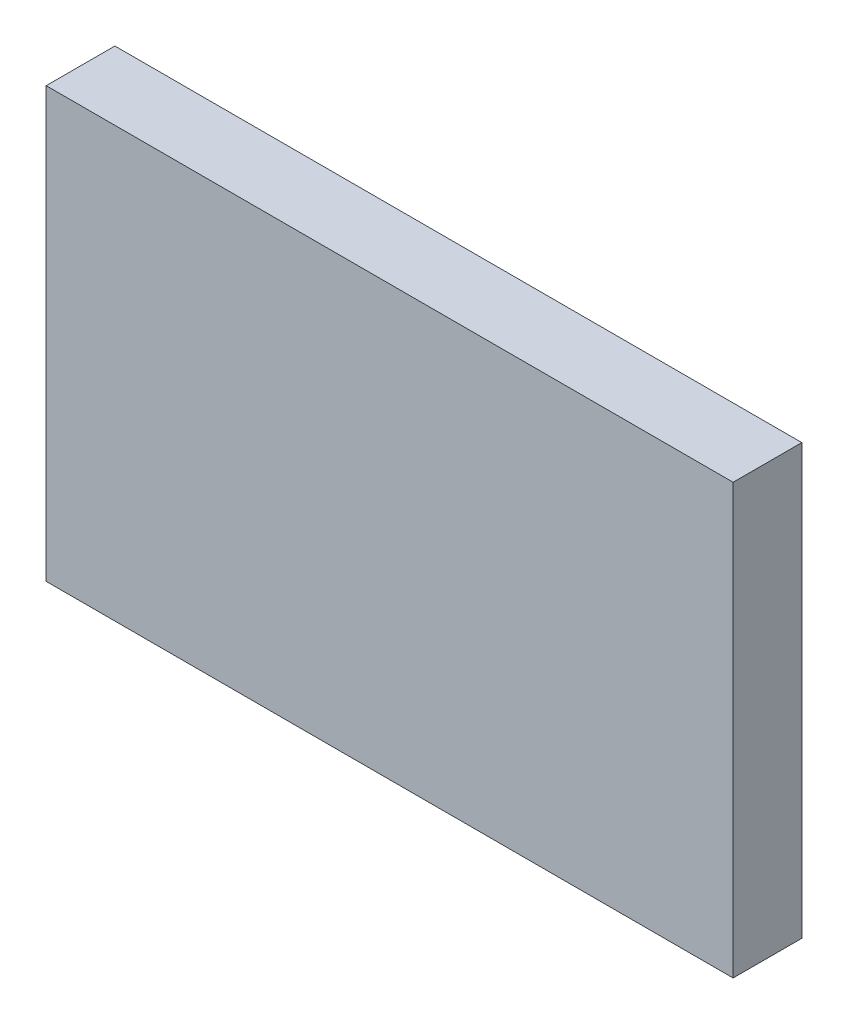
ISO-10303-21;
HEADER;
FILE_DESCRIPTION(('STEP AP214'),'2;1');
FILE_NAME('part.step','',(''),(''),'','','');
FILE_SCHEMA(('AUTOMOTIVE_DESIGN { 1 0 10303 214 1 1 1 1 }'));
ENDSEC;
DATA;
#1=APPLICATION_CONTEXT('core data for automotive mechanical design processes');
#2=APPLICATION_PROTOCOL_DEFINITION('international standard','automotive_design',2000,#1);
#3=PRODUCT_CONTEXT('',#1,'mechanical');
#4=PRODUCT('Part','Part','',(#3));
#5=PRODUCT_RELATED_PRODUCT_CATEGORY('part','',(#4));
#6=PRODUCT_DEFINITION_FORMATION('','',#4);
#7=PRODUCT_DEFINITION_CONTEXT('part definition',#1,'design');
#8=PRODUCT_DEFINITION('design','',#6,#7);
#9=PRODUCT_DEFINITION_SHAPE('','',#8);
#10=(LENGTH_UNIT() NAMED_UNIT(*) SI_UNIT(.MILLI.,.METRE.));
#11=(NAMED_UNIT(*) PLANE_ANGLE_UNIT() SI_UNIT($,.RADIAN.));
#12=(NAMED_UNIT(*) SI_UNIT($,.STERADIAN.) SOLID_ANGLE_UNIT());
#13=UNCERTAINTY_MEASURE_WITH_UNIT(LENGTH_MEASURE(1.E-05),#10,'distance_accuracy_value','');
#14=(GEOMETRIC_REPRESENTATION_CONTEXT(3) GLOBAL_UNCERTAINTY_ASSIGNED_CONTEXT((#13)) GLOBAL_UNIT_ASSIGNED_CONTEXT((#10,
#11,#12)) REPRESENTATION_CONTEXT('',''));
#15=CARTESIAN_POINT('',(0.,0.,0.));
#16=DIRECTION('',(0.,0.,1.));
#17=DIRECTION('',(1.,0.,0.));
#18=AXIS2_PLACEMENT_3D('',#15,#16,#17);
#19=CARTESIAN_POINT('',(1.00000054,-0.62500002,0.1999996));
#20=DIRECTION('',(0.,0.,1.));
#21=DIRECTION('',(1.,0.,0.));
#22=AXIS2_PLACEMENT_3D('',#19,#20,#21);
#23=PLANE('',#22);
#24=DIRECTION('',(0.,1.,0.));
#25=VECTOR('',#24,1.);
#26=CARTESIAN_POINT('',(-1.00000054,-0.62500002,0.1999996));
#27=LINE('',#26,#25);
#28=CARTESIAN_POINT('',(-1.00000054,-0.62500002,0.1999996));
#29=VERTEX_POINT('',#28);
#30=CARTESIAN_POINT('',(-1.00000054,0.62500002,0.1999996));
#31=VERTEX_POINT('',#30);
#32=EDGE_CURVE('E53',#29,#31,#27,.T.);
#33=ORIENTED_EDGE('',*,*,#32,.F.);
#34=DIRECTION('',(1.,0.,0.));
#35=VECTOR('',#34,1.);
#36=CARTESIAN_POINT('',(1.00000054,-0.62500002,0.1999996));
#37=LINE('',#36,#35);
#38=CARTESIAN_POINT('',(1.00000054,-0.62500002,0.1999996));
#39=VERTEX_POINT('',#38);
#40=EDGE_CURVE('E68',#39,#29,#37,.F.);
#41=ORIENTED_EDGE('',*,*,#40,.F.);
#42=DIRECTION('',(0.,1.,0.));
#43=VECTOR('',#42,1.);
#44=CARTESIAN_POINT('',(1.00000054,0.62500002,0.1999996));
#45=LINE('',#44,#43);
#46=CARTESIAN_POINT('',(1.00000054,0.62500002,0.1999996));
#47=VERTEX_POINT('',#46);
#48=EDGE_CURVE('E20',#47,#39,#45,.F.);
#49=ORIENTED_EDGE('',*,*,#48,.F.);
#50=DIRECTION('',(1.,0.,0.));
#51=VECTOR('',#50,1.);
#52=CARTESIAN_POINT('',(-1.00000054,0.62500002,0.1999996));
#53=LINE('',#52,#51);
#54=EDGE_CURVE('E58',#31,#47,#53,.T.);
#55=ORIENTED_EDGE('',*,*,#54,.F.);
#56=EDGE_LOOP('',(#33,#41,#49,#55));
#57=FACE_BOUND('',#56,.T.);
#58=ADVANCED_FACE('F17',(#57),#23,.T.);
#59=CARTESIAN_POINT('',(1.00000054,0.62500002,0.));
#60=DIRECTION('',(1.,0.,0.));
#61=DIRECTION('',(0.,0.,-1.));
#62=AXIS2_PLACEMENT_3D('',#59,#60,#61);
#63=PLANE('',#62);
#64=DIRECTION('',(0.,0.,-1.));
#65=VECTOR('',#64,1.);
#66=CARTESIAN_POINT('',(1.00000054,-0.62500002,0.));
#67=LINE('',#66,#65);
#68=CARTESIAN_POINT('',(1.00000054,-0.62500002,0.));
#69=VERTEX_POINT('',#68);
#70=EDGE_CURVE('E79',#69,#39,#67,.F.);
#71=ORIENTED_EDGE('',*,*,#70,.F.);
#72=DIRECTION('',(0.,1.,0.));
#73=VECTOR('',#72,1.);
#74=CARTESIAN_POINT('',(1.00000054,-0.62500002,0.));
#75=LINE('',#74,#73);
#76=CARTESIAN_POINT('',(1.00000054,0.62500002,0.));
#77=VERTEX_POINT('',#76);
#78=EDGE_CURVE('E74',#69,#77,#75,.T.);
#79=ORIENTED_EDGE('',*,*,#78,.T.);
#80=DIRECTION('',(0.,0.,1.));
#81=VECTOR('',#80,1.);
#82=CARTESIAN_POINT('',(1.00000054,0.62500002,0.));
#83=LINE('',#82,#81);
#84=EDGE_CURVE('E63',#47,#77,#83,.F.);
#85=ORIENTED_EDGE('',*,*,#84,.F.);
#86=ORIENTED_EDGE('',*,*,#48,.T.);
#87=EDGE_LOOP('',(#71,#79,#85,#86));
#88=FACE_BOUND('',#87,.T.);
#89=ADVANCED_FACE('F73',(#88),#63,.T.);
#90=CARTESIAN_POINT('',(-1.00000054,0.62500002,0.));
#91=DIRECTION('',(0.,1.,0.));
#92=DIRECTION('',(0.,0.,1.));
#93=AXIS2_PLACEMENT_3D('',#90,#91,#92);
#94=PLANE('',#93);
#95=ORIENTED_EDGE('',*,*,#84,.T.);
#96=DIRECTION('',(1.,0.,0.));
#97=VECTOR('',#96,1.);
#98=CARTESIAN_POINT('',(1.00000054,0.62500002,0.));
#99=LINE('',#98,#97);
#100=CARTESIAN_POINT('',(-1.00000054,0.62500002,0.));
#101=VERTEX_POINT('',#100);
#102=EDGE_CURVE('E84',#77,#101,#99,.F.);
#103=ORIENTED_EDGE('',*,*,#102,.T.);
#104=DIRECTION('',(0.,0.,1.));
#105=VECTOR('',#104,1.);
#106=CARTESIAN_POINT('',(-1.00000054,0.62500002,0.));
#107=LINE('',#106,#105);
#108=EDGE_CURVE('E65',#31,#101,#107,.F.);
#109=ORIENTED_EDGE('',*,*,#108,.F.);
#110=ORIENTED_EDGE('',*,*,#54,.T.);
#111=EDGE_LOOP('',(#95,#103,#109,#110));
#112=FACE_BOUND('',#111,.T.);
#113=ADVANCED_FACE('F60',(#112),#94,.T.);
#114=CARTESIAN_POINT('',(-1.00000054,-0.62500002,0.));
#115=DIRECTION('',(-1.,0.,0.));
#116=DIRECTION('',(0.,0.,1.));
#117=AXIS2_PLACEMENT_3D('',#114,#115,#116);
#118=PLANE('',#117);
#119=ORIENTED_EDGE('',*,*,#108,.T.);
#120=DIRECTION('',(0.,1.,0.));
#121=VECTOR('',#120,1.);
#122=CARTESIAN_POINT('',(-1.00000054,-0.62500002,0.));
#123=LINE('',#122,#121);
#124=CARTESIAN_POINT('',(-1.00000054,-0.62500002,0.));
#125=VERTEX_POINT('',#124);
#126=EDGE_CURVE('E26',#101,#125,#123,.F.);
#127=ORIENTED_EDGE('',*,*,#126,.T.);
#128=DIRECTION('',(0.,0.,-1.));
#129=VECTOR('',#128,1.);
#130=CARTESIAN_POINT('',(-1.00000054,-0.62500002,0.));
#131=LINE('',#130,#129);
#132=EDGE_CURVE('E34',#29,#125,#131,.T.);
#133=ORIENTED_EDGE('',*,*,#132,.F.);
#134=ORIENTED_EDGE('',*,*,#32,.T.);
#135=EDGE_LOOP('',(#119,#127,#133,#134));
#136=FACE_BOUND('',#135,.T.);
#137=ADVANCED_FACE('F88',(#136),#118,.T.);
#138=CARTESIAN_POINT('',(1.00000054,-0.62500002,0.));
#139=DIRECTION('',(0.,-1.,0.));
#140=DIRECTION('',(0.,0.,-1.));
#141=AXIS2_PLACEMENT_3D('',#138,#139,#140);
#142=PLANE('',#141);
#143=ORIENTED_EDGE('',*,*,#132,.T.);
#144=DIRECTION('',(1.,0.,0.));
#145=VECTOR('',#144,1.);
#146=CARTESIAN_POINT('',(1.00000054,-0.62500002,0.));
#147=LINE('',#146,#145);
#148=EDGE_CURVE('E11',#125,#69,#147,.T.);
#149=ORIENTED_EDGE('',*,*,#148,.T.);
#150=ORIENTED_EDGE('',*,*,#70,.T.);
#151=ORIENTED_EDGE('',*,*,#40,.T.);
#152=EDGE_LOOP('',(#143,#149,#150,#151));
#153=FACE_BOUND('',#152,.T.);
#154=ADVANCED_FACE('F91',(#153),#142,.T.);
#155=CARTESIAN_POINT('',(1.00000054,-0.62500002,0.));
#156=DIRECTION('',(0.,0.,1.));
#157=DIRECTION('',(1.,0.,0.));
#158=AXIS2_PLACEMENT_3D('',#155,#156,#157);
#159=PLANE('',#158);
#160=ORIENTED_EDGE('',*,*,#126,.F.);
#161=ORIENTED_EDGE('',*,*,#102,.F.);
#162=ORIENTED_EDGE('',*,*,#78,.F.);
#163=ORIENTED_EDGE('',*,*,#148,.F.);
#164=EDGE_LOOP('',(#160,#161,#162,#163));
#165=FACE_BOUND('',#164,.T.);
#166=ADVANCED_FACE('F90',(#165),#159,.F.);
#167=CLOSED_SHELL('',(#58,#89,#113,#137,#154,#166));
#168=MANIFOLD_SOLID_BREP('B1',#167);
#169=ADVANCED_BREP_SHAPE_REPRESENTATION('',(#18,#168),#14);
#170=SHAPE_DEFINITION_REPRESENTATION(#9,#169);
ENDSEC;
END-ISO-10303-21;
